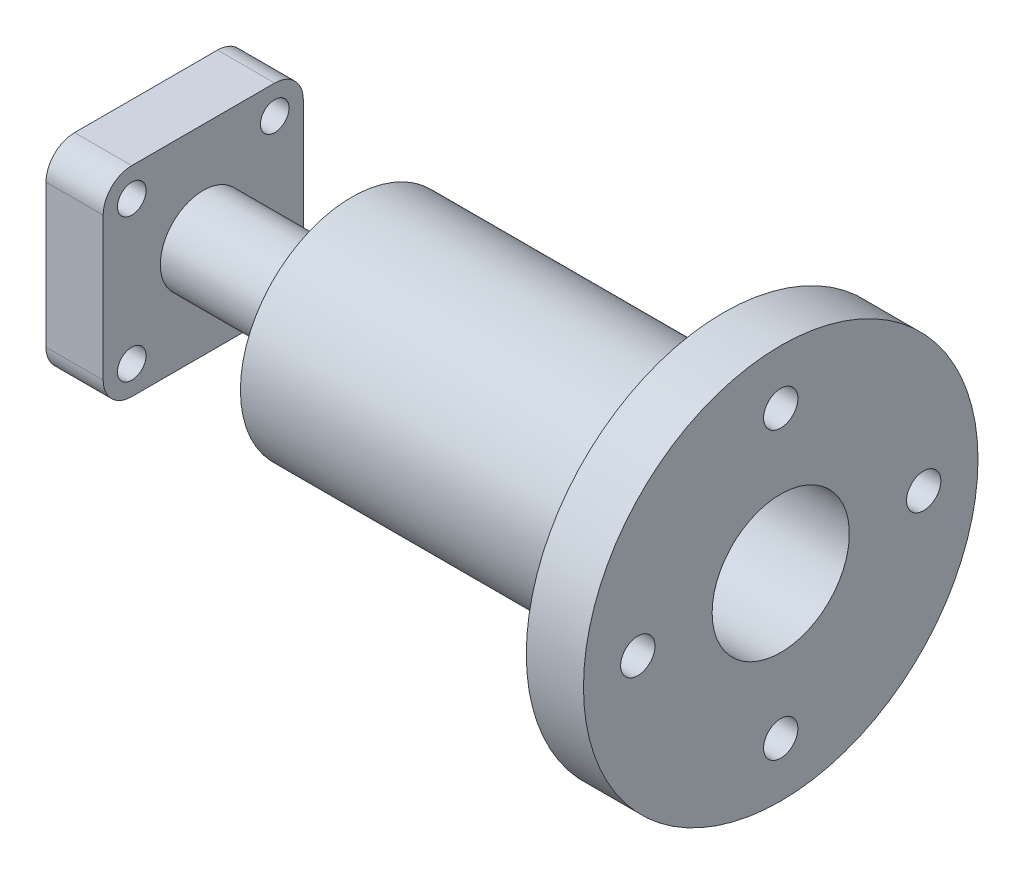
ISO-10303-21;
HEADER;
FILE_DESCRIPTION(('STEP AP214'),'2;1');
FILE_NAME('part.step','',(''),(''),'','','');
FILE_SCHEMA(('AUTOMOTIVE_DESIGN { 1 0 10303 214 1 1 1 1 }'));
ENDSEC;
DATA;
#1=APPLICATION_CONTEXT('core data for automotive mechanical design processes');
#2=APPLICATION_PROTOCOL_DEFINITION('international standard','automotive_design',2000,#1);
#3=PRODUCT_CONTEXT('',#1,'mechanical');
#4=PRODUCT('Part','Part','',(#3));
#5=PRODUCT_RELATED_PRODUCT_CATEGORY('part','',(#4));
#6=PRODUCT_DEFINITION_FORMATION('','',#4);
#7=PRODUCT_DEFINITION_CONTEXT('part definition',#1,'design');
#8=PRODUCT_DEFINITION('design','',#6,#7);
#9=PRODUCT_DEFINITION_SHAPE('','',#8);
#10=(LENGTH_UNIT() NAMED_UNIT(*) SI_UNIT(.MILLI.,.METRE.));
#11=(NAMED_UNIT(*) PLANE_ANGLE_UNIT() SI_UNIT($,.RADIAN.));
#12=(NAMED_UNIT(*) SI_UNIT($,.STERADIAN.) SOLID_ANGLE_UNIT());
#13=UNCERTAINTY_MEASURE_WITH_UNIT(LENGTH_MEASURE(1.E-05),#10,'distance_accuracy_value','');
#14=(GEOMETRIC_REPRESENTATION_CONTEXT(3) GLOBAL_UNCERTAINTY_ASSIGNED_CONTEXT((#13)) GLOBAL_UNIT_ASSIGNED_CONTEXT((#10,
#11,#12)) REPRESENTATION_CONTEXT('',''));
#15=CARTESIAN_POINT('',(0.,0.,0.));
#16=DIRECTION('',(0.,0.,1.));
#17=DIRECTION('',(1.,0.,0.));
#18=AXIS2_PLACEMENT_3D('',#15,#16,#17);
#19=CARTESIAN_POINT('',(182.,0.,-39.));
#20=DIRECTION('',(1.,0.,0.));
#21=DIRECTION('',(0.,0.,-1.));
#22=AXIS2_PLACEMENT_3D('',#19,#20,#21);
#23=PLANE('',#22);
#24=CARTESIAN_POINT('',(182.,50.,5.2372220082647E-13));
#25=DIRECTION('',(-1.,0.,0.));
#26=DIRECTION('',(0.,0.,1.));
#27=AXIS2_PLACEMENT_3D('',#24,#25,#26);
#28=CIRCLE('',#27,6.00000000000001);
#29=CARTESIAN_POINT('',(182.,50.,6.00000000000054));
#30=VERTEX_POINT('',#29);
#31=EDGE_CURVE('E307',#30,#30,#28,.T.);
#32=ORIENTED_EDGE('',*,*,#31,.F.);
#33=EDGE_LOOP('',(#32));
#34=FACE_BOUND('',#33,.T.);
#35=CARTESIAN_POINT('',(182.,0.,0.));
#36=DIRECTION('',(-1.,0.,0.));
#37=DIRECTION('',(0.,0.,1.));
#38=AXIS2_PLACEMENT_3D('',#35,#36,#37);
#39=CIRCLE('',#38,39.);
#40=CARTESIAN_POINT('',(182.,0.,39.));
#41=VERTEX_POINT('',#40);
#42=EDGE_CURVE('E177',#41,#41,#39,.T.);
#43=ORIENTED_EDGE('',*,*,#42,.F.);
#44=EDGE_LOOP('',(#43));
#45=FACE_BOUND('',#44,.T.);
#46=CARTESIAN_POINT('',(182.,0.,0.));
#47=DIRECTION('',(-1.,0.,0.));
#48=DIRECTION('',(0.,0.,1.));
#49=AXIS2_PLACEMENT_3D('',#46,#47,#48);
#50=CIRCLE('',#49,69.);
#51=CARTESIAN_POINT('',(182.,0.,69.));
#52=VERTEX_POINT('',#51);
#53=EDGE_CURVE('E173',#52,#52,#50,.T.);
#54=ORIENTED_EDGE('',*,*,#53,.T.);
#55=EDGE_LOOP('',(#54));
#56=FACE_BOUND('',#55,.T.);
#57=CARTESIAN_POINT('',(182.,0.,50.));
#58=DIRECTION('',(-1.,0.,0.));
#59=DIRECTION('',(0.,0.,1.));
#60=AXIS2_PLACEMENT_3D('',#57,#58,#59);
#61=CIRCLE('',#60,6.00000000000001);
#62=CARTESIAN_POINT('',(182.,0.,56.));
#63=VERTEX_POINT('',#62);
#64=EDGE_CURVE('E283',#63,#63,#61,.T.);
#65=ORIENTED_EDGE('',*,*,#64,.F.);
#66=EDGE_LOOP('',(#65));
#67=FACE_BOUND('',#66,.T.);
#68=CARTESIAN_POINT('',(182.,-50.,-1.74574066942157E-13));
#69=DIRECTION('',(-1.,0.,0.));
#70=DIRECTION('',(0.,0.,1.));
#71=AXIS2_PLACEMENT_3D('',#68,#69,#70);
#72=CIRCLE('',#71,6.00000000000001);
#73=CARTESIAN_POINT('',(182.,-50.,5.99999999999984));
#74=VERTEX_POINT('',#73);
#75=EDGE_CURVE('E291',#74,#74,#72,.T.);
#76=ORIENTED_EDGE('',*,*,#75,.F.);
#77=EDGE_LOOP('',(#76));
#78=FACE_BOUND('',#77,.T.);
#79=CARTESIAN_POINT('',(182.,0.,-50.));
#80=DIRECTION('',(-1.,0.,0.));
#81=DIRECTION('',(0.,0.,1.));
#82=AXIS2_PLACEMENT_3D('',#79,#80,#81);
#83=CIRCLE('',#82,6.00000000000001);
#84=CARTESIAN_POINT('',(182.,0.,-44.));
#85=VERTEX_POINT('',#84);
#86=EDGE_CURVE('E299',#85,#85,#83,.T.);
#87=ORIENTED_EDGE('',*,*,#86,.F.);
#88=EDGE_LOOP('',(#87));
#89=FACE_BOUND('',#88,.T.);
#90=ADVANCED_FACE('F45',(#34,#45,#56,#67,#78,#89),#23,.F.);
#91=CARTESIAN_POINT('',(0.,0.,0.));
#92=DIRECTION('',(-1.,0.,0.));
#93=DIRECTION('',(0.,0.,1.));
#94=AXIS2_PLACEMENT_3D('',#91,#92,#93);
#95=CYLINDRICAL_SURFACE('',#94,15.);
#96=CARTESIAN_POINT('',(0.,0.,0.));
#97=DIRECTION('',(-1.,0.,0.));
#98=DIRECTION('',(0.,0.,1.));
#99=AXIS2_PLACEMENT_3D('',#96,#97,#98);
#100=CIRCLE('',#99,15.);
#101=CARTESIAN_POINT('',(0.,0.,15.));
#102=VERTEX_POINT('',#101);
#103=EDGE_CURVE('E189',#102,#102,#100,.T.);
#104=ORIENTED_EDGE('',*,*,#103,.F.);
#105=EDGE_LOOP('',(#104));
#106=FACE_BOUND('',#105,.T.);
#107=CARTESIAN_POINT('',(52.,0.,0.));
#108=DIRECTION('',(-1.,0.,0.));
#109=DIRECTION('',(0.,0.,1.));
#110=AXIS2_PLACEMENT_3D('',#107,#108,#109);
#111=CIRCLE('',#110,15.);
#112=CARTESIAN_POINT('',(52.,0.,15.));
#113=VERTEX_POINT('',#112);
#114=EDGE_CURVE('E185',#113,#113,#111,.T.);
#115=ORIENTED_EDGE('',*,*,#114,.T.);
#116=EDGE_LOOP('',(#115));
#117=FACE_BOUND('',#116,.T.);
#118=ADVANCED_FACE('F316',(#106,#117),#95,.T.);
#119=CARTESIAN_POINT('',(52.,0.,-15.));
#120=DIRECTION('',(1.,0.,0.));
#121=DIRECTION('',(0.,0.,-1.));
#122=AXIS2_PLACEMENT_3D('',#119,#120,#121);
#123=PLANE('',#122);
#124=ORIENTED_EDGE('',*,*,#114,.F.);
#125=EDGE_LOOP('',(#124));
#126=FACE_BOUND('',#125,.T.);
#127=CARTESIAN_POINT('',(52.,0.,0.));
#128=DIRECTION('',(-1.,0.,0.));
#129=DIRECTION('',(0.,0.,1.));
#130=AXIS2_PLACEMENT_3D('',#127,#128,#129);
#131=CIRCLE('',#130,39.);
#132=CARTESIAN_POINT('',(52.,0.,39.));
#133=VERTEX_POINT('',#132);
#134=EDGE_CURVE('E181',#133,#133,#131,.T.);
#135=ORIENTED_EDGE('',*,*,#134,.T.);
#136=EDGE_LOOP('',(#135));
#137=FACE_BOUND('',#136,.T.);
#138=ADVANCED_FACE('F406',(#126,#137),#123,.F.);
#139=CARTESIAN_POINT('',(0.,0.,0.));
#140=DIRECTION('',(-1.,0.,0.));
#141=DIRECTION('',(0.,0.,1.));
#142=AXIS2_PLACEMENT_3D('',#139,#140,#141);
#143=CYLINDRICAL_SURFACE('',#142,39.);
#144=ORIENTED_EDGE('',*,*,#134,.F.);
#145=EDGE_LOOP('',(#144));
#146=FACE_BOUND('',#145,.T.);
#147=ORIENTED_EDGE('',*,*,#42,.T.);
#148=EDGE_LOOP('',(#147));
#149=FACE_BOUND('',#148,.T.);
#150=ADVANCED_FACE('F401',(#146,#149),#143,.T.);
#151=CARTESIAN_POINT('',(0.,0.,0.));
#152=DIRECTION('',(-1.,0.,0.));
#153=DIRECTION('',(0.,0.,1.));
#154=AXIS2_PLACEMENT_3D('',#151,#152,#153);
#155=CYLINDRICAL_SURFACE('',#154,69.);
#156=ORIENTED_EDGE('',*,*,#53,.F.);
#157=EDGE_LOOP('',(#156));
#158=FACE_BOUND('',#157,.T.);
#159=CARTESIAN_POINT('',(202.,0.,0.));
#160=DIRECTION('',(-1.,0.,0.));
#161=DIRECTION('',(0.,0.,1.));
#162=AXIS2_PLACEMENT_3D('',#159,#160,#161);
#163=CIRCLE('',#162,69.);
#164=CARTESIAN_POINT('',(202.,0.,69.));
#165=VERTEX_POINT('',#164);
#166=EDGE_CURVE('E169',#165,#165,#163,.T.);
#167=ORIENTED_EDGE('',*,*,#166,.T.);
#168=EDGE_LOOP('',(#167));
#169=FACE_BOUND('',#168,.T.);
#170=ADVANCED_FACE('F398',(#158,#169),#155,.T.);
#171=CARTESIAN_POINT('',(202.,0.,-69.));
#172=DIRECTION('',(-1.,0.,0.));
#173=DIRECTION('',(0.,0.,1.));
#174=AXIS2_PLACEMENT_3D('',#171,#172,#173);
#175=PLANE('',#174);
#176=CARTESIAN_POINT('',(202.,50.,5.2372220082647E-13));
#177=DIRECTION('',(-1.,0.,0.));
#178=DIRECTION('',(0.,0.,1.));
#179=AXIS2_PLACEMENT_3D('',#176,#177,#178);
#180=CIRCLE('',#179,6.00000000000001);
#181=CARTESIAN_POINT('',(202.,50.,6.00000000000054));
#182=VERTEX_POINT('',#181);
#183=EDGE_CURVE('E303',#182,#182,#180,.T.);
#184=ORIENTED_EDGE('',*,*,#183,.T.);
#185=EDGE_LOOP('',(#184));
#186=FACE_BOUND('',#185,.T.);
#187=CARTESIAN_POINT('',(202.,0.,-50.));
#188=DIRECTION('',(-1.,0.,0.));
#189=DIRECTION('',(0.,0.,1.));
#190=AXIS2_PLACEMENT_3D('',#187,#188,#189);
#191=CIRCLE('',#190,6.00000000000001);
#192=CARTESIAN_POINT('',(202.,0.,-44.));
#193=VERTEX_POINT('',#192);
#194=EDGE_CURVE('E295',#193,#193,#191,.T.);
#195=ORIENTED_EDGE('',*,*,#194,.T.);
#196=EDGE_LOOP('',(#195));
#197=FACE_BOUND('',#196,.T.);
#198=CARTESIAN_POINT('',(202.,-50.,-1.74574066942157E-13));
#199=DIRECTION('',(-1.,0.,0.));
#200=DIRECTION('',(0.,0.,1.));
#201=AXIS2_PLACEMENT_3D('',#198,#199,#200);
#202=CIRCLE('',#201,6.00000000000001);
#203=CARTESIAN_POINT('',(202.,-50.,5.99999999999984));
#204=VERTEX_POINT('',#203);
#205=EDGE_CURVE('E287',#204,#204,#202,.T.);
#206=ORIENTED_EDGE('',*,*,#205,.T.);
#207=EDGE_LOOP('',(#206));
#208=FACE_BOUND('',#207,.T.);
#209=CARTESIAN_POINT('',(202.,0.,50.));
#210=DIRECTION('',(-1.,0.,0.));
#211=DIRECTION('',(0.,0.,1.));
#212=AXIS2_PLACEMENT_3D('',#209,#210,#211);
#213=CIRCLE('',#212,6.00000000000001);
#214=CARTESIAN_POINT('',(202.,0.,56.));
#215=VERTEX_POINT('',#214);
#216=EDGE_CURVE('E279',#215,#215,#213,.T.);
#217=ORIENTED_EDGE('',*,*,#216,.T.);
#218=EDGE_LOOP('',(#217));
#219=FACE_BOUND('',#218,.T.);
#220=ORIENTED_EDGE('',*,*,#166,.F.);
#221=EDGE_LOOP('',(#220));
#222=FACE_BOUND('',#221,.T.);
#223=CARTESIAN_POINT('',(202.,0.,0.));
#224=DIRECTION('',(-1.,0.,0.));
#225=DIRECTION('',(0.,0.,1.));
#226=AXIS2_PLACEMENT_3D('',#223,#224,#225);
#227=CIRCLE('',#226,24.);
#228=CARTESIAN_POINT('',(202.,0.,24.));
#229=VERTEX_POINT('',#228);
#230=EDGE_CURVE('E165',#229,#229,#227,.T.);
#231=ORIENTED_EDGE('',*,*,#230,.T.);
#232=EDGE_LOOP('',(#231));
#233=FACE_BOUND('',#232,.T.);
#234=ADVANCED_FACE('F394',(#186,#197,#208,#219,#222,#233),#175,.F.);
#235=CARTESIAN_POINT('',(0.,0.,0.));
#236=DIRECTION('',(-1.,0.,0.));
#237=DIRECTION('',(0.,0.,1.));
#238=AXIS2_PLACEMENT_3D('',#235,#236,#237);
#239=CYLINDRICAL_SURFACE('',#238,24.);
#240=ORIENTED_EDGE('',*,*,#230,.F.);
#241=EDGE_LOOP('',(#240));
#242=FACE_BOUND('',#241,.T.);
#243=CARTESIAN_POINT('',(58.,0.,0.));
#244=DIRECTION('',(-1.,0.,0.));
#245=DIRECTION('',(0.,0.,1.));
#246=AXIS2_PLACEMENT_3D('',#243,#244,#245);
#247=CIRCLE('',#246,24.);
#248=CARTESIAN_POINT('',(58.,0.,24.));
#249=VERTEX_POINT('',#248);
#250=EDGE_CURVE('E161',#249,#249,#247,.T.);
#251=ORIENTED_EDGE('',*,*,#250,.T.);
#252=EDGE_LOOP('',(#251));
#253=FACE_BOUND('',#252,.T.);
#254=ADVANCED_FACE('F390',(#242,#253),#239,.F.);
#255=CARTESIAN_POINT('',(58.,0.,-24.));
#256=DIRECTION('',(-1.,0.,0.));
#257=DIRECTION('',(0.,0.,1.));
#258=AXIS2_PLACEMENT_3D('',#255,#256,#257);
#259=PLANE('',#258);
#260=ORIENTED_EDGE('',*,*,#250,.F.);
#261=EDGE_LOOP('',(#260));
#262=FACE_BOUND('',#261,.T.);
#263=CARTESIAN_POINT('',(58.,0.,0.));
#264=DIRECTION('',(-1.,0.,0.));
#265=DIRECTION('',(0.,0.,1.));
#266=AXIS2_PLACEMENT_3D('',#263,#264,#265);
#267=CIRCLE('',#266,9.00000000000001);
#268=CARTESIAN_POINT('',(58.,0.,9.00000000000001));
#269=VERTEX_POINT('',#268);
#270=EDGE_CURVE('E156',#269,#269,#267,.T.);
#271=ORIENTED_EDGE('',*,*,#270,.T.);
#272=EDGE_LOOP('',(#271));
#273=FACE_BOUND('',#272,.T.);
#274=ADVANCED_FACE('F386',(#262,#273),#259,.F.);
#275=CARTESIAN_POINT('',(0.,0.,0.));
#276=DIRECTION('',(-1.,0.,0.));
#277=DIRECTION('',(0.,0.,1.));
#278=AXIS2_PLACEMENT_3D('',#275,#276,#277);
#279=CYLINDRICAL_SURFACE('',#278,9.);
#280=ORIENTED_EDGE('',*,*,#270,.F.);
#281=EDGE_LOOP('',(#280));
#282=FACE_BOUND('',#281,.T.);
#283=CARTESIAN_POINT('',(0.,0.,0.));
#284=DIRECTION('',(-1.,0.,0.));
#285=DIRECTION('',(0.,0.,1.));
#286=AXIS2_PLACEMENT_3D('',#283,#284,#285);
#287=CIRCLE('',#286,9.);
#288=CARTESIAN_POINT('',(0.,0.,9.));
#289=VERTEX_POINT('',#288);
#290=EDGE_CURVE('E152',#289,#289,#287,.T.);
#291=ORIENTED_EDGE('',*,*,#290,.T.);
#292=EDGE_LOOP('',(#291));
#293=FACE_BOUND('',#292,.T.);
#294=ADVANCED_FACE('F370',(#282,#293),#279,.F.);
#295=CARTESIAN_POINT('',(0.,0.,0.));
#296=DIRECTION('',(-1.,0.,0.));
#297=DIRECTION('',(0.,0.,1.));
#298=AXIS2_PLACEMENT_3D('',#295,#296,#297);
#299=PLANE('',#298);
#300=CARTESIAN_POINT('',(0.,25.,25.));
#301=DIRECTION('',(-1.,0.,0.));
#302=DIRECTION('',(0.,0.,1.));
#303=AXIS2_PLACEMENT_3D('',#300,#301,#302);
#304=CIRCLE('',#303,5.00000000000001);
#305=CARTESIAN_POINT('',(0.,25.,30.));
#306=VERTEX_POINT('',#305);
#307=EDGE_CURVE('E271',#306,#306,#304,.T.);
#308=ORIENTED_EDGE('',*,*,#307,.T.);
#309=EDGE_LOOP('',(#308));
#310=FACE_BOUND('',#309,.T.);
#311=CARTESIAN_POINT('',(0.,-25.,25.));
#312=DIRECTION('',(-1.,0.,0.));
#313=DIRECTION('',(0.,0.,1.));
#314=AXIS2_PLACEMENT_3D('',#311,#312,#313);
#315=CIRCLE('',#314,5.00000000000001);
#316=CARTESIAN_POINT('',(0.,-25.,30.));
#317=VERTEX_POINT('',#316);
#318=EDGE_CURVE('E263',#317,#317,#315,.T.);
#319=ORIENTED_EDGE('',*,*,#318,.T.);
#320=EDGE_LOOP('',(#319));
#321=FACE_BOUND('',#320,.T.);
#322=CARTESIAN_POINT('',(0.,-25.,-25.));
#323=DIRECTION('',(-1.,0.,0.));
#324=DIRECTION('',(0.,0.,1.));
#325=AXIS2_PLACEMENT_3D('',#322,#323,#324);
#326=CIRCLE('',#325,5.00000000000001);
#327=CARTESIAN_POINT('',(0.,-25.,-20.));
#328=VERTEX_POINT('',#327);
#329=EDGE_CURVE('E252',#328,#328,#326,.T.);
#330=ORIENTED_EDGE('',*,*,#329,.T.);
#331=EDGE_LOOP('',(#330));
#332=FACE_BOUND('',#331,.T.);
#333=CARTESIAN_POINT('',(0.,25.,-25.));
#334=DIRECTION('',(-1.,0.,0.));
#335=DIRECTION('',(0.,0.,1.));
#336=AXIS2_PLACEMENT_3D('',#333,#334,#335);
#337=CIRCLE('',#336,5.00000000000001);
#338=CARTESIAN_POINT('',(0.,25.,-20.));
#339=VERTEX_POINT('',#338);
#340=EDGE_CURVE('E238',#339,#339,#337,.T.);
#341=ORIENTED_EDGE('',*,*,#340,.T.);
#342=EDGE_LOOP('',(#341));
#343=FACE_BOUND('',#342,.T.);
#344=ORIENTED_EDGE('',*,*,#103,.T.);
#345=EDGE_LOOP('',(#344));
#346=FACE_BOUND('',#345,.T.);
#347=DIRECTION('',(0.,-1.,0.));
#348=VECTOR('',#347,1.);
#349=CARTESIAN_POINT('',(0.,35.,-35.));
#350=LINE('',#349,#348);
#351=CARTESIAN_POINT('',(0.,25.,-35.));
#352=VERTEX_POINT('',#351);
#353=CARTESIAN_POINT('',(0.,-25.,-35.));
#354=VERTEX_POINT('',#353);
#355=EDGE_CURVE('E130',#352,#354,#350,.T.);
#356=ORIENTED_EDGE('',*,*,#355,.F.);
#357=CARTESIAN_POINT('',(0.,25.,-25.));
#358=DIRECTION('',(-1.,0.,0.));
#359=DIRECTION('',(0.,0.,1.));
#360=AXIS2_PLACEMENT_3D('',#357,#358,#359);
#361=CIRCLE('',#360,10.);
#362=CARTESIAN_POINT('',(0.,35.,-25.));
#363=VERTEX_POINT('',#362);
#364=EDGE_CURVE('E112',#352,#363,#361,.F.);
#365=ORIENTED_EDGE('',*,*,#364,.T.);
#366=DIRECTION('',(0.,0.,-1.));
#367=VECTOR('',#366,1.);
#368=CARTESIAN_POINT('',(0.,35.,-35.));
#369=LINE('',#368,#367);
#370=CARTESIAN_POINT('',(0.,35.,25.));
#371=VERTEX_POINT('',#370);
#372=EDGE_CURVE('E142',#371,#363,#369,.T.);
#373=ORIENTED_EDGE('',*,*,#372,.F.);
#374=CARTESIAN_POINT('',(0.,25.,25.));
#375=DIRECTION('',(-1.,0.,0.));
#376=DIRECTION('',(0.,0.,1.));
#377=AXIS2_PLACEMENT_3D('',#374,#375,#376);
#378=CIRCLE('',#377,10.);
#379=CARTESIAN_POINT('',(0.,25.,35.));
#380=VERTEX_POINT('',#379);
#381=EDGE_CURVE('E124',#371,#380,#378,.F.);
#382=ORIENTED_EDGE('',*,*,#381,.T.);
#383=DIRECTION('',(0.,1.,0.));
#384=VECTOR('',#383,1.);
#385=CARTESIAN_POINT('',(0.,35.,35.));
#386=LINE('',#385,#384);
#387=CARTESIAN_POINT('',(0.,-25.,35.));
#388=VERTEX_POINT('',#387);
#389=EDGE_CURVE('E148',#388,#380,#386,.T.);
#390=ORIENTED_EDGE('',*,*,#389,.F.);
#391=CARTESIAN_POINT('',(0.,-25.,25.));
#392=DIRECTION('',(-1.,0.,0.));
#393=DIRECTION('',(0.,0.,1.));
#394=AXIS2_PLACEMENT_3D('',#391,#392,#393);
#395=CIRCLE('',#394,10.);
#396=CARTESIAN_POINT('',(0.,-35.,25.));
#397=VERTEX_POINT('',#396);
#398=EDGE_CURVE('E134',#388,#397,#395,.F.);
#399=ORIENTED_EDGE('',*,*,#398,.T.);
#400=DIRECTION('',(0.,0.,1.));
#401=VECTOR('',#400,1.);
#402=CARTESIAN_POINT('',(0.,-35.,-35.));
#403=LINE('',#402,#401);
#404=CARTESIAN_POINT('',(0.,-35.,-25.));
#405=VERTEX_POINT('',#404);
#406=EDGE_CURVE('E141',#405,#397,#403,.T.);
#407=ORIENTED_EDGE('',*,*,#406,.F.);
#408=CARTESIAN_POINT('',(0.,-25.,-25.));
#409=DIRECTION('',(-1.,0.,0.));
#410=DIRECTION('',(0.,0.,1.));
#411=AXIS2_PLACEMENT_3D('',#408,#409,#410);
#412=CIRCLE('',#411,10.);
#413=EDGE_CURVE('E139',#405,#354,#412,.F.);
#414=ORIENTED_EDGE('',*,*,#413,.T.);
#415=EDGE_LOOP('',(#356,#365,#373,#382,#390,#399,#407,#414));
#416=FACE_BOUND('',#415,.T.);
#417=ADVANCED_FACE('F137',(#310,#321,#332,#343,#346,#416),#299,.F.);
#418=CARTESIAN_POINT('',(-20.,0.,0.));
#419=DIRECTION('',(-1.,0.,0.));
#420=DIRECTION('',(0.,0.,1.));
#421=AXIS2_PLACEMENT_3D('',#418,#419,#420);
#422=PLANE('',#421);
#423=CARTESIAN_POINT('',(-20.,25.,25.));
#424=DIRECTION('',(-1.,0.,0.));
#425=DIRECTION('',(0.,0.,1.));
#426=AXIS2_PLACEMENT_3D('',#423,#424,#425);
#427=CIRCLE('',#426,5.00000000000001);
#428=CARTESIAN_POINT('',(-20.,25.,30.));
#429=VERTEX_POINT('',#428);
#430=EDGE_CURVE('E275',#429,#429,#427,.T.);
#431=ORIENTED_EDGE('',*,*,#430,.F.);
#432=EDGE_LOOP('',(#431));
#433=FACE_BOUND('',#432,.T.);
#434=CARTESIAN_POINT('',(-20.,-25.,25.));
#435=DIRECTION('',(-1.,0.,0.));
#436=DIRECTION('',(0.,0.,1.));
#437=AXIS2_PLACEMENT_3D('',#434,#435,#436);
#438=CIRCLE('',#437,5.00000000000001);
#439=CARTESIAN_POINT('',(-20.,-25.,30.));
#440=VERTEX_POINT('',#439);
#441=EDGE_CURVE('E267',#440,#440,#438,.T.);
#442=ORIENTED_EDGE('',*,*,#441,.F.);
#443=EDGE_LOOP('',(#442));
#444=FACE_BOUND('',#443,.T.);
#445=CARTESIAN_POINT('',(-20.,-25.,-25.));
#446=DIRECTION('',(-1.,0.,0.));
#447=DIRECTION('',(0.,0.,1.));
#448=AXIS2_PLACEMENT_3D('',#445,#446,#447);
#449=CIRCLE('',#448,5.00000000000001);
#450=CARTESIAN_POINT('',(-20.,-25.,-20.));
#451=VERTEX_POINT('',#450);
#452=EDGE_CURVE('E257',#451,#451,#449,.T.);
#453=ORIENTED_EDGE('',*,*,#452,.F.);
#454=EDGE_LOOP('',(#453));
#455=FACE_BOUND('',#454,.T.);
#456=CARTESIAN_POINT('',(-20.,25.,-25.));
#457=DIRECTION('',(-1.,0.,0.));
#458=DIRECTION('',(0.,0.,1.));
#459=AXIS2_PLACEMENT_3D('',#456,#457,#458);
#460=CIRCLE('',#459,5.00000000000001);
#461=CARTESIAN_POINT('',(-20.,25.,-20.));
#462=VERTEX_POINT('',#461);
#463=EDGE_CURVE('E247',#462,#462,#460,.T.);
#464=ORIENTED_EDGE('',*,*,#463,.F.);
#465=EDGE_LOOP('',(#464));
#466=FACE_BOUND('',#465,.T.);
#467=DIRECTION('',(0.,0.,-1.));
#468=VECTOR('',#467,1.);
#469=CARTESIAN_POINT('',(-20.,35.,-35.));
#470=LINE('',#469,#468);
#471=CARTESIAN_POINT('',(-20.,35.,25.));
#472=VERTEX_POINT('',#471);
#473=CARTESIAN_POINT('',(-20.,35.,-25.));
#474=VERTEX_POINT('',#473);
#475=EDGE_CURVE('E228',#472,#474,#470,.T.);
#476=ORIENTED_EDGE('',*,*,#475,.T.);
#477=CARTESIAN_POINT('',(-20.,25.,-25.));
#478=DIRECTION('',(-1.,0.,0.));
#479=DIRECTION('',(0.,0.,1.));
#480=AXIS2_PLACEMENT_3D('',#477,#478,#479);
#481=CIRCLE('',#480,10.);
#482=CARTESIAN_POINT('',(-20.,25.,-35.));
#483=VERTEX_POINT('',#482);
#484=EDGE_CURVE('E214',#474,#483,#481,.T.);
#485=ORIENTED_EDGE('',*,*,#484,.T.);
#486=DIRECTION('',(0.,-1.,0.));
#487=VECTOR('',#486,1.);
#488=CARTESIAN_POINT('',(-20.,35.,-35.));
#489=LINE('',#488,#487);
#490=CARTESIAN_POINT('',(-20.,-25.,-35.));
#491=VERTEX_POINT('',#490);
#492=EDGE_CURVE('E132',#483,#491,#489,.T.);
#493=ORIENTED_EDGE('',*,*,#492,.T.);
#494=CARTESIAN_POINT('',(-20.,-25.,-25.));
#495=DIRECTION('',(-1.,0.,0.));
#496=DIRECTION('',(0.,0.,1.));
#497=AXIS2_PLACEMENT_3D('',#494,#495,#496);
#498=CIRCLE('',#497,10.);
#499=CARTESIAN_POINT('',(-20.,-35.,-25.));
#500=VERTEX_POINT('',#499);
#501=EDGE_CURVE('E67',#491,#500,#498,.T.);
#502=ORIENTED_EDGE('',*,*,#501,.T.);
#503=DIRECTION('',(0.,0.,1.));
#504=VECTOR('',#503,1.);
#505=CARTESIAN_POINT('',(-20.,-35.,-35.));
#506=LINE('',#505,#504);
#507=CARTESIAN_POINT('',(-20.,-35.,25.));
#508=VERTEX_POINT('',#507);
#509=EDGE_CURVE('E157',#500,#508,#506,.T.);
#510=ORIENTED_EDGE('',*,*,#509,.T.);
#511=CARTESIAN_POINT('',(-20.,-25.,25.));
#512=DIRECTION('',(-1.,0.,0.));
#513=DIRECTION('',(0.,0.,1.));
#514=AXIS2_PLACEMENT_3D('',#511,#512,#513);
#515=CIRCLE('',#514,10.);
#516=CARTESIAN_POINT('',(-20.,-25.,35.));
#517=VERTEX_POINT('',#516);
#518=EDGE_CURVE('E206',#508,#517,#515,.T.);
#519=ORIENTED_EDGE('',*,*,#518,.T.);
#520=DIRECTION('',(0.,1.,0.));
#521=VECTOR('',#520,1.);
#522=CARTESIAN_POINT('',(-20.,35.,35.));
#523=LINE('',#522,#521);
#524=CARTESIAN_POINT('',(-20.,25.,35.));
#525=VERTEX_POINT('',#524);
#526=EDGE_CURVE('E146',#517,#525,#523,.T.);
#527=ORIENTED_EDGE('',*,*,#526,.T.);
#528=CARTESIAN_POINT('',(-20.,25.,25.));
#529=DIRECTION('',(-1.,0.,0.));
#530=DIRECTION('',(0.,0.,1.));
#531=AXIS2_PLACEMENT_3D('',#528,#529,#530);
#532=CIRCLE('',#531,10.);
#533=EDGE_CURVE('E211',#525,#472,#532,.T.);
#534=ORIENTED_EDGE('',*,*,#533,.T.);
#535=EDGE_LOOP('',(#476,#485,#493,#502,#510,#519,#527,#534));
#536=FACE_BOUND('',#535,.T.);
#537=ADVANCED_FACE('F363',(#433,#444,#455,#466,#536),#422,.T.);
#538=CARTESIAN_POINT('',(-20.,-35.,-35.));
#539=DIRECTION('',(0.,1.,0.));
#540=DIRECTION('',(0.,0.,1.));
#541=AXIS2_PLACEMENT_3D('',#538,#539,#540);
#542=PLANE('',#541);
#543=ORIENTED_EDGE('',*,*,#509,.F.);
#544=DIRECTION('',(1.,0.,0.));
#545=VECTOR('',#544,1.);
#546=CARTESIAN_POINT('',(-20.,-35.,-25.));
#547=LINE('',#546,#545);
#548=EDGE_CURVE('E11',#500,#405,#547,.T.);
#549=ORIENTED_EDGE('',*,*,#548,.T.);
#550=ORIENTED_EDGE('',*,*,#406,.T.);
#551=DIRECTION('',(1.,0.,0.));
#552=VECTOR('',#551,1.);
#553=CARTESIAN_POINT('',(-20.,-35.,25.));
#554=LINE('',#553,#552);
#555=EDGE_CURVE('E54',#397,#508,#554,.F.);
#556=ORIENTED_EDGE('',*,*,#555,.T.);
#557=EDGE_LOOP('',(#543,#549,#550,#556));
#558=FACE_BOUND('',#557,.T.);
#559=ADVANCED_FACE('F366',(#558),#542,.F.);
#560=CARTESIAN_POINT('',(-20.,35.,-35.));
#561=DIRECTION('',(0.,0.,1.));
#562=DIRECTION('',(0.,-1.,0.));
#563=AXIS2_PLACEMENT_3D('',#560,#561,#562);
#564=PLANE('',#563);
#565=ORIENTED_EDGE('',*,*,#492,.F.);
#566=DIRECTION('',(1.,0.,0.));
#567=VECTOR('',#566,1.);
#568=CARTESIAN_POINT('',(-20.,25.,-35.));
#569=LINE('',#568,#567);
#570=EDGE_CURVE('E116',#483,#352,#569,.T.);
#571=ORIENTED_EDGE('',*,*,#570,.T.);
#572=ORIENTED_EDGE('',*,*,#355,.T.);
#573=DIRECTION('',(1.,0.,0.));
#574=VECTOR('',#573,1.);
#575=CARTESIAN_POINT('',(-20.,-25.,-35.));
#576=LINE('',#575,#574);
#577=EDGE_CURVE('E135',#354,#491,#576,.F.);
#578=ORIENTED_EDGE('',*,*,#577,.T.);
#579=EDGE_LOOP('',(#565,#571,#572,#578));
#580=FACE_BOUND('',#579,.T.);
#581=ADVANCED_FACE('F129',(#580),#564,.F.);
#582=CARTESIAN_POINT('',(-20.,35.,-35.));
#583=DIRECTION('',(0.,-1.,0.));
#584=DIRECTION('',(0.,0.,-1.));
#585=AXIS2_PLACEMENT_3D('',#582,#583,#584);
#586=PLANE('',#585);
#587=ORIENTED_EDGE('',*,*,#372,.T.);
#588=DIRECTION('',(1.,0.,0.));
#589=VECTOR('',#588,1.);
#590=CARTESIAN_POINT('',(-20.,35.,-25.));
#591=LINE('',#590,#589);
#592=EDGE_CURVE('E117',#363,#474,#591,.F.);
#593=ORIENTED_EDGE('',*,*,#592,.T.);
#594=ORIENTED_EDGE('',*,*,#475,.F.);
#595=DIRECTION('',(1.,0.,0.));
#596=VECTOR('',#595,1.);
#597=CARTESIAN_POINT('',(-20.,35.,25.));
#598=LINE('',#597,#596);
#599=EDGE_CURVE('E123',#472,#371,#598,.T.);
#600=ORIENTED_EDGE('',*,*,#599,.T.);
#601=EDGE_LOOP('',(#587,#593,#594,#600));
#602=FACE_BOUND('',#601,.T.);
#603=ADVANCED_FACE('F377',(#602),#586,.F.);
#604=CARTESIAN_POINT('',(-20.,35.,35.));
#605=DIRECTION('',(0.,0.,-1.));
#606=DIRECTION('',(0.,1.,0.));
#607=AXIS2_PLACEMENT_3D('',#604,#605,#606);
#608=PLANE('',#607);
#609=ORIENTED_EDGE('',*,*,#389,.T.);
#610=DIRECTION('',(1.,0.,0.));
#611=VECTOR('',#610,1.);
#612=CARTESIAN_POINT('',(-20.,25.,35.));
#613=LINE('',#612,#611);
#614=EDGE_CURVE('E221',#380,#525,#613,.F.);
#615=ORIENTED_EDGE('',*,*,#614,.T.);
#616=ORIENTED_EDGE('',*,*,#526,.F.);
#617=DIRECTION('',(1.,0.,0.));
#618=VECTOR('',#617,1.);
#619=CARTESIAN_POINT('',(-20.,-25.,35.));
#620=LINE('',#619,#618);
#621=EDGE_CURVE('E217',#517,#388,#620,.T.);
#622=ORIENTED_EDGE('',*,*,#621,.T.);
#623=EDGE_LOOP('',(#609,#615,#616,#622));
#624=FACE_BOUND('',#623,.T.);
#625=ADVANCED_FACE('F380',(#624),#608,.F.);
#626=ORIENTED_EDGE('',*,*,#290,.F.);
#627=EDGE_LOOP('',(#626));
#628=FACE_BOUND('',#627,.T.);
#629=ADVANCED_FACE('F372',(#628),#299,.F.);
#630=CARTESIAN_POINT('',(-20.,25.,-25.));
#631=DIRECTION('',(1.,0.,0.));
#632=DIRECTION('',(0.,0.,-1.));
#633=AXIS2_PLACEMENT_3D('',#630,#631,#632);
#634=CYLINDRICAL_SURFACE('',#633,10.);
#635=ORIENTED_EDGE('',*,*,#484,.F.);
#636=ORIENTED_EDGE('',*,*,#592,.F.);
#637=ORIENTED_EDGE('',*,*,#364,.F.);
#638=ORIENTED_EDGE('',*,*,#570,.F.);
#639=EDGE_LOOP('',(#635,#636,#637,#638));
#640=FACE_BOUND('',#639,.T.);
#641=ADVANCED_FACE('F115',(#640),#634,.T.);
#642=CARTESIAN_POINT('',(-20.,25.,25.));
#643=DIRECTION('',(1.,0.,0.));
#644=DIRECTION('',(0.,0.,-1.));
#645=AXIS2_PLACEMENT_3D('',#642,#643,#644);
#646=CYLINDRICAL_SURFACE('',#645,10.);
#647=ORIENTED_EDGE('',*,*,#533,.F.);
#648=ORIENTED_EDGE('',*,*,#614,.F.);
#649=ORIENTED_EDGE('',*,*,#381,.F.);
#650=ORIENTED_EDGE('',*,*,#599,.F.);
#651=EDGE_LOOP('',(#647,#648,#649,#650));
#652=FACE_BOUND('',#651,.T.);
#653=ADVANCED_FACE('F416',(#652),#646,.T.);
#654=CARTESIAN_POINT('',(-20.,-25.,-25.));
#655=DIRECTION('',(1.,0.,0.));
#656=DIRECTION('',(0.,0.,-1.));
#657=AXIS2_PLACEMENT_3D('',#654,#655,#656);
#658=CYLINDRICAL_SURFACE('',#657,10.);
#659=ORIENTED_EDGE('',*,*,#501,.F.);
#660=ORIENTED_EDGE('',*,*,#577,.F.);
#661=ORIENTED_EDGE('',*,*,#413,.F.);
#662=ORIENTED_EDGE('',*,*,#548,.F.);
#663=EDGE_LOOP('',(#659,#660,#661,#662));
#664=FACE_BOUND('',#663,.T.);
#665=ADVANCED_FACE('F418',(#664),#658,.T.);
#666=CARTESIAN_POINT('',(-20.,-25.,25.));
#667=DIRECTION('',(1.,0.,0.));
#668=DIRECTION('',(0.,0.,-1.));
#669=AXIS2_PLACEMENT_3D('',#666,#667,#668);
#670=CYLINDRICAL_SURFACE('',#669,10.);
#671=ORIENTED_EDGE('',*,*,#518,.F.);
#672=ORIENTED_EDGE('',*,*,#555,.F.);
#673=ORIENTED_EDGE('',*,*,#398,.F.);
#674=ORIENTED_EDGE('',*,*,#621,.F.);
#675=EDGE_LOOP('',(#671,#672,#673,#674));
#676=FACE_BOUND('',#675,.T.);
#677=ADVANCED_FACE('F47',(#676),#670,.T.);
#678=CARTESIAN_POINT('',(-20.,25.,-25.));
#679=DIRECTION('',(-1.,0.,0.));
#680=DIRECTION('',(0.,0.,1.));
#681=AXIS2_PLACEMENT_3D('',#678,#679,#680);
#682=CYLINDRICAL_SURFACE('',#681,5.00000000000001);
#683=ORIENTED_EDGE('',*,*,#340,.F.);
#684=EDGE_LOOP('',(#683));
#685=FACE_BOUND('',#684,.T.);
#686=ORIENTED_EDGE('',*,*,#463,.T.);
#687=EDGE_LOOP('',(#686));
#688=FACE_BOUND('',#687,.T.);
#689=ADVANCED_FACE('F358',(#685,#688),#682,.F.);
#690=CARTESIAN_POINT('',(-20.,-25.,-25.));
#691=DIRECTION('',(-1.,0.,0.));
#692=DIRECTION('',(0.,0.,1.));
#693=AXIS2_PLACEMENT_3D('',#690,#691,#692);
#694=CYLINDRICAL_SURFACE('',#693,5.00000000000001);
#695=ORIENTED_EDGE('',*,*,#329,.F.);
#696=EDGE_LOOP('',(#695));
#697=FACE_BOUND('',#696,.T.);
#698=ORIENTED_EDGE('',*,*,#452,.T.);
#699=EDGE_LOOP('',(#698));
#700=FACE_BOUND('',#699,.T.);
#701=ADVANCED_FACE('F354',(#697,#700),#694,.F.);
#702=CARTESIAN_POINT('',(-20.,-25.,25.));
#703=DIRECTION('',(-1.,0.,0.));
#704=DIRECTION('',(0.,0.,1.));
#705=AXIS2_PLACEMENT_3D('',#702,#703,#704);
#706=CYLINDRICAL_SURFACE('',#705,5.00000000000001);
#707=ORIENTED_EDGE('',*,*,#318,.F.);
#708=EDGE_LOOP('',(#707));
#709=FACE_BOUND('',#708,.T.);
#710=ORIENTED_EDGE('',*,*,#441,.T.);
#711=EDGE_LOOP('',(#710));
#712=FACE_BOUND('',#711,.T.);
#713=ADVANCED_FACE('F350',(#709,#712),#706,.F.);
#714=CARTESIAN_POINT('',(-20.,25.,25.));
#715=DIRECTION('',(-1.,0.,0.));
#716=DIRECTION('',(0.,0.,1.));
#717=AXIS2_PLACEMENT_3D('',#714,#715,#716);
#718=CYLINDRICAL_SURFACE('',#717,5.00000000000001);
#719=ORIENTED_EDGE('',*,*,#307,.F.);
#720=EDGE_LOOP('',(#719));
#721=FACE_BOUND('',#720,.T.);
#722=ORIENTED_EDGE('',*,*,#430,.T.);
#723=EDGE_LOOP('',(#722));
#724=FACE_BOUND('',#723,.T.);
#725=ADVANCED_FACE('F346',(#721,#724),#718,.F.);
#726=CARTESIAN_POINT('',(182.,0.,50.));
#727=DIRECTION('',(-1.,0.,0.));
#728=DIRECTION('',(0.,0.,1.));
#729=AXIS2_PLACEMENT_3D('',#726,#727,#728);
#730=CYLINDRICAL_SURFACE('',#729,6.00000000000001);
#731=ORIENTED_EDGE('',*,*,#216,.F.);
#732=EDGE_LOOP('',(#731));
#733=FACE_BOUND('',#732,.T.);
#734=ORIENTED_EDGE('',*,*,#64,.T.);
#735=EDGE_LOOP('',(#734));
#736=FACE_BOUND('',#735,.T.);
#737=ADVANCED_FACE('F339',(#733,#736),#730,.F.);
#738=CARTESIAN_POINT('',(182.,-50.,-1.74574066942157E-13));
#739=DIRECTION('',(-1.,0.,0.));
#740=DIRECTION('',(0.,0.,1.));
#741=AXIS2_PLACEMENT_3D('',#738,#739,#740);
#742=CYLINDRICAL_SURFACE('',#741,6.00000000000001);
#743=ORIENTED_EDGE('',*,*,#205,.F.);
#744=EDGE_LOOP('',(#743));
#745=FACE_BOUND('',#744,.T.);
#746=ORIENTED_EDGE('',*,*,#75,.T.);
#747=EDGE_LOOP('',(#746));
#748=FACE_BOUND('',#747,.T.);
#749=ADVANCED_FACE('F330',(#745,#748),#742,.F.);
#750=CARTESIAN_POINT('',(182.,0.,-50.));
#751=DIRECTION('',(-1.,0.,0.));
#752=DIRECTION('',(0.,0.,1.));
#753=AXIS2_PLACEMENT_3D('',#750,#751,#752);
#754=CYLINDRICAL_SURFACE('',#753,6.00000000000001);
#755=ORIENTED_EDGE('',*,*,#194,.F.);
#756=EDGE_LOOP('',(#755));
#757=FACE_BOUND('',#756,.T.);
#758=ORIENTED_EDGE('',*,*,#86,.T.);
#759=EDGE_LOOP('',(#758));
#760=FACE_BOUND('',#759,.T.);
#761=ADVANCED_FACE('F328',(#757,#760),#754,.F.);
#762=CARTESIAN_POINT('',(182.,50.,5.2372220082647E-13));
#763=DIRECTION('',(-1.,0.,0.));
#764=DIRECTION('',(0.,0.,1.));
#765=AXIS2_PLACEMENT_3D('',#762,#763,#764);
#766=CYLINDRICAL_SURFACE('',#765,6.00000000000001);
#767=ORIENTED_EDGE('',*,*,#183,.F.);
#768=EDGE_LOOP('',(#767));
#769=FACE_BOUND('',#768,.T.);
#770=ORIENTED_EDGE('',*,*,#31,.T.);
#771=EDGE_LOOP('',(#770));
#772=FACE_BOUND('',#771,.T.);
#773=ADVANCED_FACE('F312',(#769,#772),#766,.F.);
#774=CLOSED_SHELL('',(#90,#118,#138,#150,#170,#234,#254,#274,#294,#417,#537,#559,#581,#603,#625,
#629,#641,#653,#665,#677,#689,#701,#713,#725,#737,#749,#761,#773));
#775=MANIFOLD_SOLID_BREP('B2',#774);
#776=ADVANCED_BREP_SHAPE_REPRESENTATION('',(#18,#775),#14);
#777=SHAPE_DEFINITION_REPRESENTATION(#9,#776);
ENDSEC;
END-ISO-10303-21;
